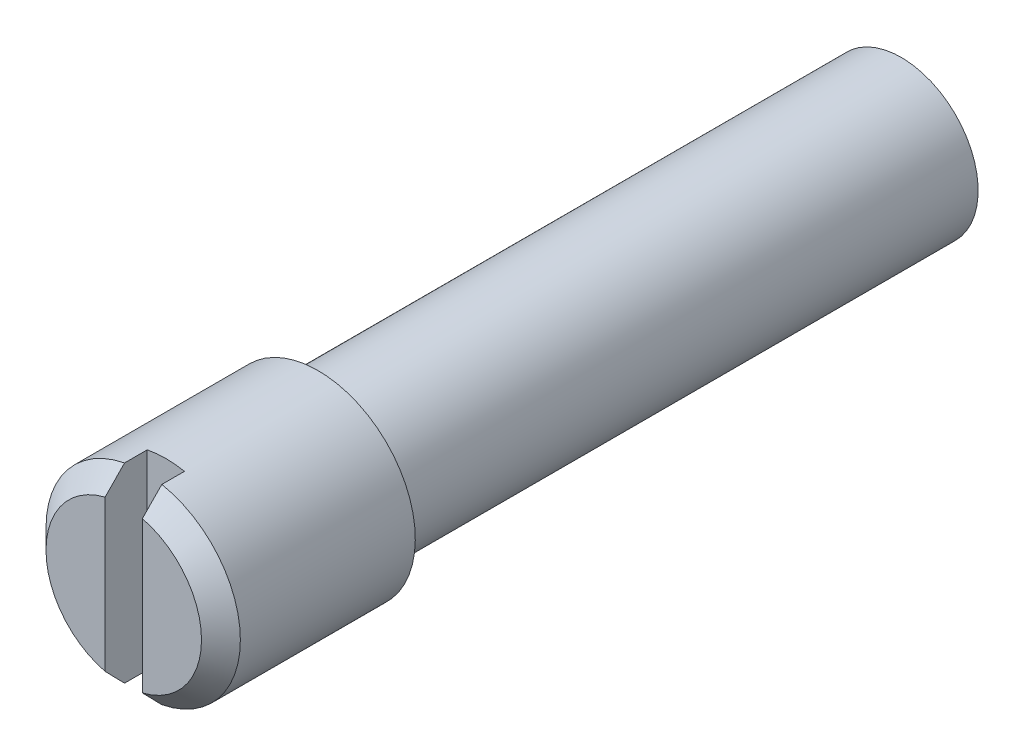
ISO-10303-21;
HEADER;
FILE_DESCRIPTION(('STEP AP214'),'2;1');
FILE_NAME('part.step','',(''),(''),'','','');
FILE_SCHEMA(('AUTOMOTIVE_DESIGN { 1 0 10303 214 1 1 1 1 }'));
ENDSEC;
DATA;
#1=APPLICATION_CONTEXT('core data for automotive mechanical design processes');
#2=APPLICATION_PROTOCOL_DEFINITION('international standard','automotive_design',2000,#1);
#3=PRODUCT_CONTEXT('',#1,'mechanical');
#4=PRODUCT('Part','Part','',(#3));
#5=PRODUCT_RELATED_PRODUCT_CATEGORY('part','',(#4));
#6=PRODUCT_DEFINITION_FORMATION('','',#4);
#7=PRODUCT_DEFINITION_CONTEXT('part definition',#1,'design');
#8=PRODUCT_DEFINITION('design','',#6,#7);
#9=PRODUCT_DEFINITION_SHAPE('','',#8);
#10=(LENGTH_UNIT() NAMED_UNIT(*) SI_UNIT(.MILLI.,.METRE.));
#11=(NAMED_UNIT(*) PLANE_ANGLE_UNIT() SI_UNIT($,.RADIAN.));
#12=(NAMED_UNIT(*) SI_UNIT($,.STERADIAN.) SOLID_ANGLE_UNIT());
#13=UNCERTAINTY_MEASURE_WITH_UNIT(LENGTH_MEASURE(1.E-05),#10,'distance_accuracy_value','');
#14=(GEOMETRIC_REPRESENTATION_CONTEXT(3) GLOBAL_UNCERTAINTY_ASSIGNED_CONTEXT((#13)) GLOBAL_UNIT_ASSIGNED_CONTEXT((#10,
#11,#12)) REPRESENTATION_CONTEXT('',''));
#15=CARTESIAN_POINT('',(0.,0.,0.));
#16=DIRECTION('',(0.,0.,1.));
#17=DIRECTION('',(1.,0.,0.));
#18=AXIS2_PLACEMENT_3D('',#15,#16,#17);
#19=CARTESIAN_POINT('',(0.,0.,24.));
#20=DIRECTION('',(0.,0.,1.));
#21=DIRECTION('',(1.,0.,0.));
#22=AXIS2_PLACEMENT_3D('',#19,#20,#21);
#23=PLANE('',#22);
#24=DIRECTION('',(0.,1.,0.));
#25=VECTOR('',#24,1.);
#26=CARTESIAN_POINT('',(0.575000000000002,3.58431409968318,24.));
#27=LINE('',#26,#25);
#28=CARTESIAN_POINT('',(0.575000000000002,-2.33010192910096,24.));
#29=VERTEX_POINT('',#28);
#30=CARTESIAN_POINT('',(0.575000000000002,2.33010192910096,24.));
#31=VERTEX_POINT('',#30);
#32=EDGE_CURVE('E85',#29,#31,#27,.T.);
#33=ORIENTED_EDGE('',*,*,#32,.F.);
#34=CARTESIAN_POINT('',(0.,0.,24.));
#35=DIRECTION('',(0.,0.,1.));
#36=DIRECTION('',(1.,0.,0.));
#37=AXIS2_PLACEMENT_3D('',#34,#35,#36);
#38=CIRCLE('',#37,2.4);
#39=EDGE_CURVE('E94',#29,#31,#38,.T.);
#40=ORIENTED_EDGE('',*,*,#39,.T.);
#41=EDGE_LOOP('',(#33,#40));
#42=FACE_BOUND('',#41,.T.);
#43=ADVANCED_FACE('F31',(#42),#23,.T.);
#44=CARTESIAN_POINT('',(0.,0.,24.));
#45=DIRECTION('',(0.,0.,-1.));
#46=DIRECTION('',(-1.,0.,0.));
#47=AXIS2_PLACEMENT_3D('',#44,#45,#46);
#48=CONICAL_SURFACE('',#47,2.4,0.785398163397446);
#49=CARTESIAN_POINT('',(0.575000000000003,-6.59312926945243,19.7818447763965));
#50=CARTESIAN_POINT('',(0.575000000000003,-6.3570964178443,20.0169770028979));
#51=CARTESIAN_POINT('',(0.575000000000003,-6.12102350434961,20.2520690691919));
#52=CARTESIAN_POINT('',(0.575000000000003,-5.64872691261279,20.7221318088984));
#53=CARTESIAN_POINT('',(0.575000000000003,-5.41250322572117,20.9571024736196));
#54=CARTESIAN_POINT('',(0.575000000000003,-4.93950365619047,21.42721000768));
#55=CARTESIAN_POINT('',(0.575000000000003,-4.70272748115898,21.6623465829228));
#56=CARTESIAN_POINT('',(0.575000000000003,-4.228891285384,22.1323042407032));
#57=CARTESIAN_POINT('',(0.575000000000003,-3.99183128313815,22.3671253418874));
#58=CARTESIAN_POINT('',(0.575000000000003,-3.53198659244999,22.8216767533858));
#59=CARTESIAN_POINT('',(0.575000000000003,-3.30923145290617,23.0414369228728));
#60=CARTESIAN_POINT('',(0.575000000000003,-2.9744951954244,23.3705052473913));
#61=CARTESIAN_POINT('',(0.575000000000003,-2.86280537475571,23.4801095939932));
#62=CARTESIAN_POINT('',(0.575000000000003,-2.63915127081751,23.6990339828422));
#63=CARTESIAN_POINT('',(0.575000000000002,-2.5271869925122,23.808354030159));
#64=CARTESIAN_POINT('',(0.575000000000002,-2.30296013049013,24.0264852234634));
#65=CARTESIAN_POINT('',(0.575000000000002,-2.19069790799758,24.1352967401953));
#66=CARTESIAN_POINT('',(0.575000000000002,-1.9655513416286,24.3522900346638));
#67=CARTESIAN_POINT('',(0.575000000000002,-1.85266695528828,24.4604717683538));
#68=CARTESIAN_POINT('',(0.575000000000002,-1.62593990065105,24.6757589047874));
#69=CARTESIAN_POINT('',(0.575000000000002,-1.51209755523095,24.7828646454356));
#70=CARTESIAN_POINT('',(0.575000000000002,-1.33996549047905,24.9420324228302));
#71=CARTESIAN_POINT('',(0.575000000000002,-1.28236331894692,24.9948369517064));
#72=CARTESIAN_POINT('',(0.575000000000002,-1.16650067082472,25.099717643086));
#73=CARTESIAN_POINT('',(0.575000000000002,-1.10824022107627,25.1517938350954));
#74=CARTESIAN_POINT('',(0.575000000000002,-1.01663706607063,25.2321259439611));
#75=CARTESIAN_POINT('',(0.575000000000002,-0.983629880776111,25.2607640393697));
#76=CARTESIAN_POINT('',(0.575000000000002,-0.917219901440699,25.317585698555));
#77=CARTESIAN_POINT('',(0.575000000000002,-0.883817068538578,25.3457692170293));
#78=CARTESIAN_POINT('',(0.575000000000002,-0.816136033915849,25.4018320658795));
#79=CARTESIAN_POINT('',(0.575000000000002,-0.781852251531451,25.4297046831826));
#80=CARTESIAN_POINT('',(0.575000000000002,-0.712607859585735,25.4845829784367));
#81=CARTESIAN_POINT('',(0.575000000000002,-0.67764741911762,25.5115888686064));
#82=CARTESIAN_POINT('',(0.575000000000002,-0.606365737887848,25.5646972154228));
#83=CARTESIAN_POINT('',(0.575000000000002,-0.57003302683411,25.5907844061948));
#84=CARTESIAN_POINT('',(0.575000000000002,-0.496017611200607,25.6411071944057));
#85=CARTESIAN_POINT('',(0.575000000000002,-0.458333167861284,25.6653402715251));
#86=CARTESIAN_POINT('',(0.575000000000002,-0.381601491155703,25.710584538662));
#87=CARTESIAN_POINT('',(0.575000000000002,-0.34257409011689,25.7316285817863));
#88=CARTESIAN_POINT('',(0.575000000000002,-0.262366245409516,25.7689666273082));
#89=CARTESIAN_POINT('',(0.575000000000002,-0.221193134792467,25.7852756982041));
#90=CARTESIAN_POINT('',(0.575000000000002,-0.140024804650021,25.8093355507813));
#91=CARTESIAN_POINT('',(0.575000000000002,-0.100223886532226,25.8176929033447));
#92=CARTESIAN_POINT('',(0.575000000000002,-0.0399672803968205,25.8239623694623));
#93=CARTESIAN_POINT('',(0.575000000000002,-0.0198231659861653,25.8250111965358));
#94=CARTESIAN_POINT('',(0.575000000000002,0.0204629447610192,25.8249886254974));
#95=CARTESIAN_POINT('',(0.575000000000002,0.0406049409998008,25.8239171538152));
#96=CARTESIAN_POINT('',(0.575000000000002,0.100461525570517,25.8176256306175));
#97=CARTESIAN_POINT('',(0.575000000000002,0.139879099491969,25.8093553849565));
#98=CARTESIAN_POINT('',(0.575000000000002,0.197620103118983,25.7922750703771));
#99=CARTESIAN_POINT('',(0.575000000000002,0.216704682210089,25.7857694015423));
#100=CARTESIAN_POINT('',(0.575000000000002,0.254390737914861,25.7714792584862));
#101=CARTESIAN_POINT('',(0.575000000000002,0.272992293748338,25.7636949955188));
#102=CARTESIAN_POINT('',(0.575000000000002,0.324640254828575,25.740356230253));
#103=CARTESIAN_POINT('',(0.575000000000002,0.35715015000409,25.7236250799254));
#104=CARTESIAN_POINT('',(0.575000000000002,0.42091119959424,25.6878939283381));
#105=CARTESIAN_POINT('',(0.575000000000002,0.452160888441109,25.6688913818293));
#106=CARTESIAN_POINT('',(0.575000000000002,0.513761848644359,25.6292741634638));
#107=CARTESIAN_POINT('',(0.575000000000002,0.544109708234715,25.6086542355238));
#108=CARTESIAN_POINT('',(0.575000000000002,0.604031588020998,25.5663139380691));
#109=CARTESIAN_POINT('',(0.575000000000002,0.633605417888416,25.5445933016823));
#110=CARTESIAN_POINT('',(0.575000000000002,0.721982924276324,25.4778462038738));
#111=CARTESIAN_POINT('',(0.575000000000002,0.779874624663518,25.4316174587775));
#112=CARTESIAN_POINT('',(0.575000000000002,0.894038775481094,25.337499487122));
#113=CARTESIAN_POINT('',(0.575000000000002,0.950314690896955,25.2896143893851));
#114=CARTESIAN_POINT('',(0.575000000000002,1.06069326396575,25.1937819290499));
#115=CARTESIAN_POINT('',(0.575000000000002,1.11481659840131,25.1458583305429));
#116=CARTESIAN_POINT('',(0.575000000000002,1.22242502304039,25.0493003313255));
#117=CARTESIAN_POINT('',(0.575000000000002,1.27591009725863,25.0006659128803));
#118=CARTESIAN_POINT('',(0.575000000000002,1.43570679817587,24.8540166913754));
#119=CARTESIAN_POINT('',(0.575000000000002,1.54134492446662,24.7552691704513));
#120=CARTESIAN_POINT('',(0.575000000000002,1.75175219862635,24.5566097406059));
#121=CARTESIAN_POINT('',(0.575000000000002,1.85652016203505,24.4566965852508));
#122=CARTESIAN_POINT('',(0.575000000000002,2.06542640643829,24.256230515321));
#123=CARTESIAN_POINT('',(0.575000000000002,2.16956473543903,24.1556776507515));
#124=CARTESIAN_POINT('',(0.575000000000002,2.37647975707732,23.9550771649454));
#125=CARTESIAN_POINT('',(0.575000000000002,2.47926017380029,23.8550333787957));
#126=CARTESIAN_POINT('',(0.575000000000002,2.684543591866,23.6546576197975));
#127=CARTESIAN_POINT('',(0.575000000000002,2.78704658763555,23.5543256412415));
#128=CARTESIAN_POINT('',(0.575000000000002,3.09416588315918,23.2531169867328));
#129=CARTESIAN_POINT('',(0.575000000000002,3.29848507131354,23.0519375076927));
#130=CARTESIAN_POINT('',(0.575000000000002,3.75962327628997,22.5968858636406));
#131=CARTESIAN_POINT('',(0.575000000000002,4.01631243698611,22.3428822613999));
#132=CARTESIAN_POINT('',(0.575000000000002,4.52933752254673,21.8344364137882));
#133=CARTESIAN_POINT('',(0.575000000000002,4.78567338403653,21.5799941045024));
#134=CARTESIAN_POINT('',(0.575000000000002,5.30064454173647,21.0683405585328));
#135=CARTESIAN_POINT('',(0.575000000000002,5.55927742354804,20.8111268925968));
#136=CARTESIAN_POINT('',(0.575000000000002,6.07633173046753,20.29657220616));
#137=CARTESIAN_POINT('',(0.575000000000002,6.33475318338172,20.0392312136034));
#138=CARTESIAN_POINT('',(0.575000000000001,6.59312926945243,19.7818447763965));
#139=B_SPLINE_CURVE_WITH_KNOTS('',3,(#49,#50,#51,#52,#53,#54,#55,#56,#57,#58,#59,#60,#61,#62,
#63,#64,#65,#66,#67,#68,#69,#70,#71,#72,#73,#74,#75,#76,#77,#78,#79,#80,#81,#82,#83,#84,#85,#86,
#87,#88,#89,#90,#91,#92,#93,#94,#95,#96,#97,#98,#99,#100,#101,#102,#103,#104,#105,#106,#107,
#108,#109,#110,#111,#112,#113,#114,#115,#116,#117,#118,#119,#120,#121,#122,#123,#124,#125,#126,
#127,#128,#129,#130,#131,#132,#133,#134,#135,#136,#137,#138),.UNSPECIFIED.,.F.,.F.,(4,2,2,2,2,2,
2,2,2,2,2,2,2,2,2,2,2,2,2,2,2,2,2,2,2,2,2,2,2,2,2,2,2,2,2,2,2,2,2,2,2,2,2,2,4),(0.,
0.999493943174397,1.99905158465975,3.00013555578808,4.00115749476848,4.93989441509241,
5.40935071866154,5.87879859277671,6.34782203247568,6.81687789045536,7.28578152726739,
7.52020700738761,7.75462296294086,7.88571735436554,8.01682473069356,8.14936815090477,
8.28187886627371,8.41602519997535,8.55035075514004,8.68318149613732,8.81558476509494,
8.93680346530898,8.99721222232403,9.05762307543927,9.17763984702793,9.23810037425017,
9.29855092200075,9.4080907791949,9.51775455446285,9.62779078180932,9.73785381682175,
9.96003163733522,10.1816907261015,10.3985538820445,10.6154224579945,11.0492195895781,
11.48353324243,11.9178133527361,12.3481069693293,12.7784091669954,13.6386260398391,
14.7219833076911,15.8055146233209,16.8997944535853,17.9938940989063),.UNSPECIFIED.);
#140=CARTESIAN_POINT('',(0.575000000000003,-2.94438024039016,23.4));
#141=VERTEX_POINT('',#140);
#142=EDGE_CURVE('E82',#141,#29,#139,.T.);
#143=ORIENTED_EDGE('',*,*,#142,.F.);
#144=CARTESIAN_POINT('',(0.,0.,23.4));
#145=DIRECTION('',(0.,0.,1.));
#146=DIRECTION('',(1.,0.,0.));
#147=AXIS2_PLACEMENT_3D('',#144,#145,#146);
#148=CIRCLE('',#147,3.);
#149=CARTESIAN_POINT('',(0.575000000000002,2.94438024039016,23.4));
#150=VERTEX_POINT('',#149);
#151=EDGE_CURVE('E101',#150,#141,#148,.F.);
#152=ORIENTED_EDGE('',*,*,#151,.F.);
#153=EDGE_CURVE('E91',#31,#150,#139,.T.);
#154=ORIENTED_EDGE('',*,*,#153,.F.);
#155=ORIENTED_EDGE('',*,*,#39,.F.);
#156=EDGE_LOOP('',(#143,#152,#154,#155));
#157=FACE_BOUND('',#156,.T.);
#158=ADVANCED_FACE('F96',(#157),#48,.T.);
#159=CARTESIAN_POINT('',(0.,0.,0.));
#160=DIRECTION('',(0.,0.,1.));
#161=DIRECTION('',(1.,0.,0.));
#162=AXIS2_PLACEMENT_3D('',#159,#160,#161);
#163=CYLINDRICAL_SURFACE('',#162,3.);
#164=DIRECTION('',(0.,0.,1.));
#165=VECTOR('',#164,1.);
#166=CARTESIAN_POINT('',(0.575000000000003,-2.94438024039016,0.));
#167=LINE('',#166,#165);
#168=CARTESIAN_POINT('',(0.575000000000002,-2.94438024039016,22.7));
#169=VERTEX_POINT('',#168);
#170=EDGE_CURVE('E55',#169,#141,#167,.T.);
#171=ORIENTED_EDGE('',*,*,#170,.F.);
#172=CARTESIAN_POINT('',(0.,0.,22.7));
#173=DIRECTION('',(0.,0.,-1.));
#174=DIRECTION('',(-1.,0.,0.));
#175=AXIS2_PLACEMENT_3D('',#172,#173,#174);
#176=CIRCLE('',#175,3.);
#177=CARTESIAN_POINT('',(-0.574999999999997,-2.94438024039016,22.7));
#178=VERTEX_POINT('',#177);
#179=EDGE_CURVE('E12',#178,#169,#176,.F.);
#180=ORIENTED_EDGE('',*,*,#179,.F.);
#181=DIRECTION('',(0.,0.,1.));
#182=VECTOR('',#181,1.);
#183=CARTESIAN_POINT('',(-0.574999999999998,-2.94438024039016,0.));
#184=LINE('',#183,#182);
#185=CARTESIAN_POINT('',(-0.574999999999998,-2.94438024039016,23.4));
#186=VERTEX_POINT('',#185);
#187=EDGE_CURVE('E221',#186,#178,#184,.F.);
#188=ORIENTED_EDGE('',*,*,#187,.F.);
#189=CARTESIAN_POINT('',(-0.574999999999998,2.94438024039016,23.4));
#190=VERTEX_POINT('',#189);
#191=EDGE_CURVE('E109',#186,#190,#148,.F.);
#192=ORIENTED_EDGE('',*,*,#191,.T.);
#193=DIRECTION('',(0.,0.,1.));
#194=VECTOR('',#193,1.);
#195=CARTESIAN_POINT('',(-0.574999999999998,2.94438024039016,0.));
#196=LINE('',#195,#194);
#197=CARTESIAN_POINT('',(-0.574999999999998,2.94438024039016,22.7));
#198=VERTEX_POINT('',#197);
#199=EDGE_CURVE('E212',#198,#190,#196,.T.);
#200=ORIENTED_EDGE('',*,*,#199,.F.);
#201=CARTESIAN_POINT('',(0.575000000000002,2.94438024039016,22.7));
#202=VERTEX_POINT('',#201);
#203=EDGE_CURVE('E36',#202,#198,#176,.F.);
#204=ORIENTED_EDGE('',*,*,#203,.F.);
#205=DIRECTION('',(0.,0.,1.));
#206=VECTOR('',#205,1.);
#207=CARTESIAN_POINT('',(0.575000000000002,2.94438024039016,0.));
#208=LINE('',#207,#206);
#209=EDGE_CURVE('E207',#150,#202,#208,.F.);
#210=ORIENTED_EDGE('',*,*,#209,.F.);
#211=ORIENTED_EDGE('',*,*,#151,.T.);
#212=EDGE_LOOP('',(#171,#180,#188,#192,#200,#204,#210,#211));
#213=FACE_BOUND('',#212,.T.);
#214=CARTESIAN_POINT('',(0.,0.,18.));
#215=DIRECTION('',(0.,0.,-1.));
#216=DIRECTION('',(-1.,0.,0.));
#217=AXIS2_PLACEMENT_3D('',#214,#215,#216);
#218=CIRCLE('',#217,3.);
#219=CARTESIAN_POINT('',(-3.,0.,18.));
#220=VERTEX_POINT('',#219);
#221=EDGE_CURVE('E98',#220,#220,#218,.F.);
#222=ORIENTED_EDGE('',*,*,#221,.T.);
#223=EDGE_LOOP('',(#222));
#224=FACE_BOUND('',#223,.T.);
#225=ADVANCED_FACE('F141',(#213,#224),#163,.T.);
#226=DIRECTION('',(0.,-1.,0.));
#227=VECTOR('',#226,1.);
#228=CARTESIAN_POINT('',(-0.574999999999998,3.58431409968318,24.));
#229=LINE('',#228,#227);
#230=CARTESIAN_POINT('',(-0.574999999999998,2.33010192910096,24.));
#231=VERTEX_POINT('',#230);
#232=CARTESIAN_POINT('',(-0.574999999999997,-2.33010192910096,24.));
#233=VERTEX_POINT('',#232);
#234=EDGE_CURVE('E47',#231,#233,#229,.T.);
#235=ORIENTED_EDGE('',*,*,#234,.F.);
#236=EDGE_CURVE('E97',#231,#233,#38,.T.);
#237=ORIENTED_EDGE('',*,*,#236,.T.);
#238=EDGE_LOOP('',(#235,#237));
#239=FACE_BOUND('',#238,.T.);
#240=ADVANCED_FACE('F143',(#239),#23,.T.);
#241=CARTESIAN_POINT('',(-0.574999999999999,6.59312926945244,19.7818447763965));
#242=CARTESIAN_POINT('',(-0.574999999999999,6.3570964178443,20.0169770028979));
#243=CARTESIAN_POINT('',(-0.574999999999999,6.12102350434961,20.2520690691919));
#244=CARTESIAN_POINT('',(-0.574999999999999,5.64872691261278,20.7221318088984));
#245=CARTESIAN_POINT('',(-0.574999999999999,5.41250322572115,20.9571024736196));
#246=CARTESIAN_POINT('',(-0.574999999999999,4.93950365619044,21.42721000768));
#247=CARTESIAN_POINT('',(-0.574999999999998,4.70272748115894,21.6623465829228));
#248=CARTESIAN_POINT('',(-0.574999999999998,4.22889128538396,22.1323042407032));
#249=CARTESIAN_POINT('',(-0.574999999999998,3.9918312831381,22.3671253418874));
#250=CARTESIAN_POINT('',(-0.574999999999998,3.53198659244994,22.8216767533859));
#251=CARTESIAN_POINT('',(-0.574999999999998,3.30923145290613,23.0414369228729));
#252=CARTESIAN_POINT('',(-0.574999999999998,2.97449519542436,23.3705052473914));
#253=CARTESIAN_POINT('',(-0.574999999999998,2.86280537475568,23.4801095939932));
#254=CARTESIAN_POINT('',(-0.574999999999998,2.63915127081748,23.6990339828423));
#255=CARTESIAN_POINT('',(-0.574999999999998,2.52718699251217,23.808354030159));
#256=CARTESIAN_POINT('',(-0.574999999999998,2.3029601304901,24.0264852234634));
#257=CARTESIAN_POINT('',(-0.574999999999998,2.19069790799755,24.1352967401953));
#258=CARTESIAN_POINT('',(-0.574999999999998,1.96555134162858,24.3522900346638));
#259=CARTESIAN_POINT('',(-0.574999999999998,1.85266695528827,24.4604717683538));
#260=CARTESIAN_POINT('',(-0.574999999999998,1.62593990065103,24.6757589047874));
#261=CARTESIAN_POINT('',(-0.574999999999998,1.51209755523094,24.7828646454356));
#262=CARTESIAN_POINT('',(-0.574999999999998,1.33996549047904,24.9420324228302));
#263=CARTESIAN_POINT('',(-0.574999999999998,1.28236331894691,24.9948369517064));
#264=CARTESIAN_POINT('',(-0.574999999999998,1.16650067082471,25.099717643086));
#265=CARTESIAN_POINT('',(-0.574999999999998,1.10824022107627,25.1517938350954));
#266=CARTESIAN_POINT('',(-0.574999999999998,1.01663706607062,25.2321259439611));
#267=CARTESIAN_POINT('',(-0.574999999999998,0.983629880776105,25.2607640393697));
#268=CARTESIAN_POINT('',(-0.574999999999998,0.917219901440694,25.317585698555));
#269=CARTESIAN_POINT('',(-0.574999999999998,0.883817068538575,25.3457692170293));
#270=CARTESIAN_POINT('',(-0.574999999999998,0.816136033915847,25.4018320658795));
#271=CARTESIAN_POINT('',(-0.574999999999998,0.781852251531448,25.4297046831826));
#272=CARTESIAN_POINT('',(-0.574999999999998,0.712607859585732,25.4845829784367));
#273=CARTESIAN_POINT('',(-0.574999999999998,0.677647419117618,25.5115888686064));
#274=CARTESIAN_POINT('',(-0.574999999999998,0.606365737887847,25.5646972154228));
#275=CARTESIAN_POINT('',(-0.574999999999998,0.570033026834108,25.5907844061948));
#276=CARTESIAN_POINT('',(-0.574999999999998,0.496017611200604,25.6411071944057));
#277=CARTESIAN_POINT('',(-0.574999999999998,0.458333167861282,25.6653402715251));
#278=CARTESIAN_POINT('',(-0.574999999999998,0.3816014911557,25.710584538662));
#279=CARTESIAN_POINT('',(-0.574999999999998,0.342574090116887,25.7316285817863));
#280=CARTESIAN_POINT('',(-0.574999999999998,0.262366245409514,25.7689666273082));
#281=CARTESIAN_POINT('',(-0.574999999999998,0.221193134792467,25.7852756982041));
#282=CARTESIAN_POINT('',(-0.574999999999998,0.140024804650021,25.8093355507813));
#283=CARTESIAN_POINT('',(-0.574999999999998,0.100223886532227,25.8176929033447));
#284=CARTESIAN_POINT('',(-0.574999999999998,0.0399672803968206,25.8239623694623));
#285=CARTESIAN_POINT('',(-0.574999999999998,0.0198231659861655,25.8250111965358));
#286=CARTESIAN_POINT('',(-0.574999999999998,-0.0204629447610189,25.8249886254974));
#287=CARTESIAN_POINT('',(-0.574999999999998,-0.0406049409998005,25.8239171538152));
#288=CARTESIAN_POINT('',(-0.574999999999998,-0.100461525570517,25.8176256306175));
#289=CARTESIAN_POINT('',(-0.574999999999998,-0.139879099491969,25.8093553849565));
#290=CARTESIAN_POINT('',(-0.574999999999998,-0.197620103118982,25.7922750703771));
#291=CARTESIAN_POINT('',(-0.574999999999998,-0.216704682210088,25.7857694015423));
#292=CARTESIAN_POINT('',(-0.574999999999998,-0.25439073791486,25.7714792584862));
#293=CARTESIAN_POINT('',(-0.574999999999998,-0.272992293748338,25.7636949955188));
#294=CARTESIAN_POINT('',(-0.574999999999998,-0.324640254828576,25.740356230253));
#295=CARTESIAN_POINT('',(-0.574999999999998,-0.357150150004089,25.7236250799254));
#296=CARTESIAN_POINT('',(-0.574999999999998,-0.420911199594239,25.6878939283381));
#297=CARTESIAN_POINT('',(-0.574999999999998,-0.452160888441108,25.6688913818293));
#298=CARTESIAN_POINT('',(-0.574999999999998,-0.513761848644358,25.6292741634638));
#299=CARTESIAN_POINT('',(-0.574999999999998,-0.544109708234713,25.6086542355238));
#300=CARTESIAN_POINT('',(-0.574999999999998,-0.604031588020996,25.5663139380691));
#301=CARTESIAN_POINT('',(-0.574999999999998,-0.633605417888414,25.5445933016823));
#302=CARTESIAN_POINT('',(-0.574999999999998,-0.721982924276323,25.4778462038738));
#303=CARTESIAN_POINT('',(-0.574999999999998,-0.779874624663518,25.4316174587775));
#304=CARTESIAN_POINT('',(-0.574999999999998,-0.894038775481094,25.337499487122));
#305=CARTESIAN_POINT('',(-0.574999999999998,-0.950314690896953,25.2896143893851));
#306=CARTESIAN_POINT('',(-0.574999999999998,-1.06069326396575,25.19378192905));
#307=CARTESIAN_POINT('',(-0.574999999999998,-1.11481659840131,25.1458583305429));
#308=CARTESIAN_POINT('',(-0.574999999999998,-1.22242502304039,25.0493003313255));
#309=CARTESIAN_POINT('',(-0.574999999999998,-1.27591009725862,25.0006659128803));
#310=CARTESIAN_POINT('',(-0.574999999999998,-1.43570679817586,24.8540166913754));
#311=CARTESIAN_POINT('',(-0.574999999999998,-1.54134492446662,24.7552691704513));
#312=CARTESIAN_POINT('',(-0.574999999999998,-1.75175219862635,24.5566097406059));
#313=CARTESIAN_POINT('',(-0.574999999999998,-1.85652016203505,24.4566965852508));
#314=CARTESIAN_POINT('',(-0.574999999999998,-2.06542640643828,24.256230515321));
#315=CARTESIAN_POINT('',(-0.574999999999998,-2.16956473543903,24.1556776507515));
#316=CARTESIAN_POINT('',(-0.574999999999998,-2.37647975707732,23.9550771649454));
#317=CARTESIAN_POINT('',(-0.574999999999998,-2.47926017380029,23.8550333787957));
#318=CARTESIAN_POINT('',(-0.574999999999998,-2.684543591866,23.6546576197975));
#319=CARTESIAN_POINT('',(-0.574999999999998,-2.78704658763555,23.5543256412415));
#320=CARTESIAN_POINT('',(-0.574999999999998,-3.09416588315917,23.2531169867328));
#321=CARTESIAN_POINT('',(-0.574999999999997,-3.29848507131353,23.0519375076927));
#322=CARTESIAN_POINT('',(-0.574999999999997,-3.75962327628996,22.5968858636406));
#323=CARTESIAN_POINT('',(-0.574999999999997,-4.01631243698611,22.3428822613999));
#324=CARTESIAN_POINT('',(-0.574999999999997,-4.52933752254673,21.8344364137882));
#325=CARTESIAN_POINT('',(-0.574999999999997,-4.78567338403653,21.5799941045024));
#326=CARTESIAN_POINT('',(-0.574999999999997,-5.30064454173647,21.0683405585328));
#327=CARTESIAN_POINT('',(-0.574999999999997,-5.55927742354804,20.8111268925968));
#328=CARTESIAN_POINT('',(-0.574999999999997,-6.07633173046753,20.29657220616));
#329=CARTESIAN_POINT('',(-0.574999999999997,-6.33475318338172,20.0392312136034));
#330=CARTESIAN_POINT('',(-0.574999999999997,-6.59312926945244,19.7818447763965));
#331=B_SPLINE_CURVE_WITH_KNOTS('',3,(#241,#242,#243,#244,#245,#246,#247,#248,#249,#250,#251,
#252,#253,#254,#255,#256,#257,#258,#259,#260,#261,#262,#263,#264,#265,#266,#267,#268,#269,#270,
#271,#272,#273,#274,#275,#276,#277,#278,#279,#280,#281,#282,#283,#284,#285,#286,#287,#288,#289,
#290,#291,#292,#293,#294,#295,#296,#297,#298,#299,#300,#301,#302,#303,#304,#305,#306,#307,#308,
#309,#310,#311,#312,#313,#314,#315,#316,#317,#318,#319,#320,#321,#322,#323,#324,#325,#326,#327,
#328,#329,#330),.UNSPECIFIED.,.F.,.F.,(4,2,2,2,2,2,2,2,2,2,2,2,2,2,2,2,2,2,2,2,2,2,2,2,2,2,2,2,
2,2,2,2,2,2,2,2,2,2,2,2,2,2,2,2,4),(0.,0.999493943174416,1.99905158465979,3.00013555578815,
4.00115749476856,4.93989441509248,5.4093507186616,5.87879859277676,6.34782203247572,
6.81687789045539,7.28578152726741,7.52020700738762,7.75462296294087,7.88571735436555,
8.01682473069357,8.14936815090478,8.28187886627372,8.41602519997536,8.55035075514005,
8.68318149613733,8.81558476509495,8.93680346530899,8.99721222232403,9.05762307543928,
9.17763984702794,9.23810037425018,9.29855092200076,9.4080907791949,9.51775455446285,
9.62779078180932,9.73785381682176,9.96003163733523,10.1816907261015,10.3985538820445,
10.6154224579945,11.0492195895781,11.48353324243,11.9178133527361,12.3481069693293,
12.7784091669954,13.6386260398391,14.7219833076911,15.8055146233209,16.8997944535853,
17.9938940989063),.UNSPECIFIED.);
#332=EDGE_CURVE('E116',#190,#231,#331,.T.);
#333=ORIENTED_EDGE('',*,*,#332,.F.);
#334=ORIENTED_EDGE('',*,*,#191,.F.);
#335=EDGE_CURVE('E111',#233,#186,#331,.T.);
#336=ORIENTED_EDGE('',*,*,#335,.F.);
#337=ORIENTED_EDGE('',*,*,#236,.F.);
#338=EDGE_LOOP('',(#333,#334,#336,#337));
#339=FACE_BOUND('',#338,.T.);
#340=ADVANCED_FACE('F33',(#339),#48,.T.);
#341=CARTESIAN_POINT('',(0.,0.,18.));
#342=DIRECTION('',(0.,0.,-1.));
#343=DIRECTION('',(-1.,0.,0.));
#344=AXIS2_PLACEMENT_3D('',#341,#342,#343);
#345=PLANE('',#344);
#346=ORIENTED_EDGE('',*,*,#221,.F.);
#347=EDGE_LOOP('',(#346));
#348=FACE_BOUND('',#347,.T.);
#349=CARTESIAN_POINT('',(0.,0.,18.));
#350=DIRECTION('',(0.,0.,-1.));
#351=DIRECTION('',(-1.,0.,0.));
#352=AXIS2_PLACEMENT_3D('',#349,#350,#351);
#353=CIRCLE('',#352,2.375);
#354=CARTESIAN_POINT('',(-2.375,0.,18.));
#355=VERTEX_POINT('',#354);
#356=EDGE_CURVE('E103',#355,#355,#353,.T.);
#357=ORIENTED_EDGE('',*,*,#356,.F.);
#358=EDGE_LOOP('',(#357));
#359=FACE_BOUND('',#358,.T.);
#360=ADVANCED_FACE('F133',(#348,#359),#345,.T.);
#361=CARTESIAN_POINT('',(0.,0.,18.));
#362=DIRECTION('',(0.,0.,-1.));
#363=DIRECTION('',(-1.,0.,0.));
#364=AXIS2_PLACEMENT_3D('',#361,#362,#363);
#365=CYLINDRICAL_SURFACE('',#364,2.375);
#366=ORIENTED_EDGE('',*,*,#356,.T.);
#367=EDGE_LOOP('',(#366));
#368=FACE_BOUND('',#367,.T.);
#369=CARTESIAN_POINT('',(0.,0.,0.));
#370=DIRECTION('',(0.,0.,-1.));
#371=DIRECTION('',(-1.,0.,0.));
#372=AXIS2_PLACEMENT_3D('',#369,#370,#371);
#373=CIRCLE('',#372,2.375);
#374=CARTESIAN_POINT('',(-2.375,0.,0.));
#375=VERTEX_POINT('',#374);
#376=EDGE_CURVE('E107',#375,#375,#373,.T.);
#377=ORIENTED_EDGE('',*,*,#376,.F.);
#378=EDGE_LOOP('',(#377));
#379=FACE_BOUND('',#378,.T.);
#380=ADVANCED_FACE('F130',(#368,#379),#365,.T.);
#381=CARTESIAN_POINT('',(0.,0.,0.));
#382=DIRECTION('',(0.,0.,1.));
#383=DIRECTION('',(1.,0.,0.));
#384=AXIS2_PLACEMENT_3D('',#381,#382,#383);
#385=PLANE('',#384);
#386=ORIENTED_EDGE('',*,*,#376,.T.);
#387=EDGE_LOOP('',(#386));
#388=FACE_BOUND('',#387,.T.);
#389=ADVANCED_FACE('F129',(#388),#385,.F.);
#390=CARTESIAN_POINT('',(0.575000000000002,3.58431409968318,22.7));
#391=DIRECTION('',(1.,0.,0.));
#392=DIRECTION('',(0.,1.,0.));
#393=AXIS2_PLACEMENT_3D('',#390,#391,#392);
#394=PLANE('',#393);
#395=ORIENTED_EDGE('',*,*,#170,.T.);
#396=ORIENTED_EDGE('',*,*,#142,.T.);
#397=ORIENTED_EDGE('',*,*,#32,.T.);
#398=ORIENTED_EDGE('',*,*,#153,.T.);
#399=ORIENTED_EDGE('',*,*,#209,.T.);
#400=DIRECTION('',(0.,1.,0.));
#401=VECTOR('',#400,1.);
#402=CARTESIAN_POINT('',(0.575000000000002,3.58431409968318,22.7));
#403=LINE('',#402,#401);
#404=EDGE_CURVE('E201',#169,#202,#403,.T.);
#405=ORIENTED_EDGE('',*,*,#404,.F.);
#406=EDGE_LOOP('',(#395,#396,#397,#398,#399,#405));
#407=FACE_BOUND('',#406,.T.);
#408=ADVANCED_FACE('F84',(#407),#394,.F.);
#409=CARTESIAN_POINT('',(-0.574999999999998,3.58431409968318,22.7));
#410=DIRECTION('',(-1.,0.,0.));
#411=DIRECTION('',(0.,-1.,0.));
#412=AXIS2_PLACEMENT_3D('',#409,#410,#411);
#413=PLANE('',#412);
#414=ORIENTED_EDGE('',*,*,#199,.T.);
#415=ORIENTED_EDGE('',*,*,#332,.T.);
#416=ORIENTED_EDGE('',*,*,#234,.T.);
#417=ORIENTED_EDGE('',*,*,#335,.T.);
#418=ORIENTED_EDGE('',*,*,#187,.T.);
#419=DIRECTION('',(0.,-1.,0.));
#420=VECTOR('',#419,1.);
#421=CARTESIAN_POINT('',(-0.574999999999998,3.58431409968318,22.7));
#422=LINE('',#421,#420);
#423=EDGE_CURVE('E204',#198,#178,#422,.T.);
#424=ORIENTED_EDGE('',*,*,#423,.F.);
#425=EDGE_LOOP('',(#414,#415,#416,#417,#418,#424));
#426=FACE_BOUND('',#425,.T.);
#427=ADVANCED_FACE('F121',(#426),#413,.F.);
#428=CARTESIAN_POINT('',(0.575000000000003,-3.86639769512342,22.7));
#429=DIRECTION('',(0.,0.,-1.));
#430=DIRECTION('',(-1.,0.,0.));
#431=AXIS2_PLACEMENT_3D('',#428,#429,#430);
#432=PLANE('',#431);
#433=ORIENTED_EDGE('',*,*,#179,.T.);
#434=ORIENTED_EDGE('',*,*,#404,.T.);
#435=ORIENTED_EDGE('',*,*,#203,.T.);
#436=ORIENTED_EDGE('',*,*,#423,.T.);
#437=EDGE_LOOP('',(#433,#434,#435,#436));
#438=FACE_BOUND('',#437,.T.);
#439=ADVANCED_FACE('F125',(#438),#432,.F.);
#440=CLOSED_SHELL('',(#43,#158,#225,#240,#340,#360,#380,#389,#408,#427,#439));
#441=MANIFOLD_SOLID_BREP('B2',#440);
#442=ADVANCED_BREP_SHAPE_REPRESENTATION('',(#18,#441),#14);
#443=SHAPE_DEFINITION_REPRESENTATION(#9,#442);
ENDSEC;
END-ISO-10303-21;
